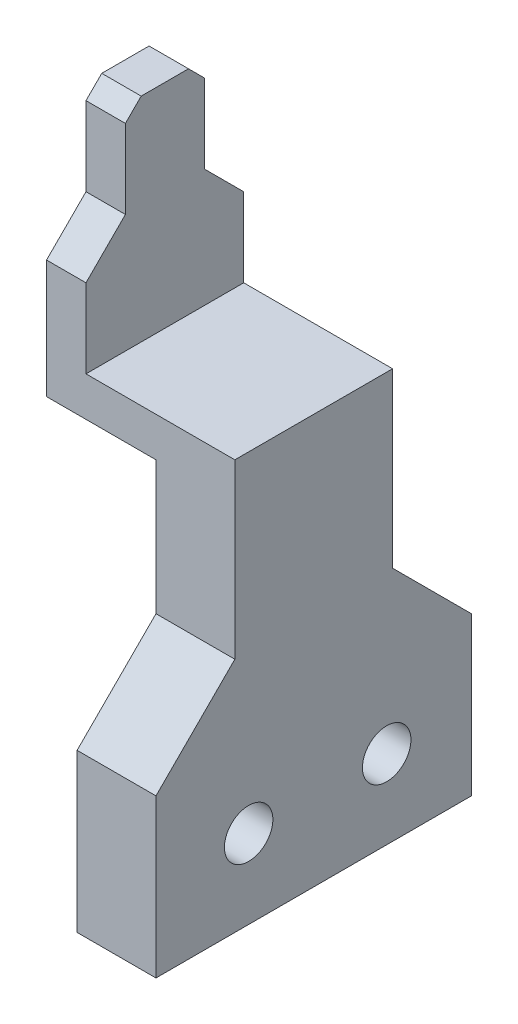
ISO-10303-21;
HEADER;
FILE_DESCRIPTION(('STEP AP214'),'2;1');
FILE_NAME('part.step','',(''),(''),'','','');
FILE_SCHEMA(('AUTOMOTIVE_DESIGN { 1 0 10303 214 1 1 1 1 }'));
ENDSEC;
DATA;
#1=APPLICATION_CONTEXT('core data for automotive mechanical design processes');
#2=APPLICATION_PROTOCOL_DEFINITION('international standard','automotive_design',2000,#1);
#3=PRODUCT_CONTEXT('',#1,'mechanical');
#4=PRODUCT('Part','Part','',(#3));
#5=PRODUCT_RELATED_PRODUCT_CATEGORY('part','',(#4));
#6=PRODUCT_DEFINITION_FORMATION('','',#4);
#7=PRODUCT_DEFINITION_CONTEXT('part definition',#1,'design');
#8=PRODUCT_DEFINITION('design','',#6,#7);
#9=PRODUCT_DEFINITION_SHAPE('','',#8);
#10=(LENGTH_UNIT() NAMED_UNIT(*) SI_UNIT(.MILLI.,.METRE.));
#11=(NAMED_UNIT(*) PLANE_ANGLE_UNIT() SI_UNIT($,.RADIAN.));
#12=(NAMED_UNIT(*) SI_UNIT($,.STERADIAN.) SOLID_ANGLE_UNIT());
#13=UNCERTAINTY_MEASURE_WITH_UNIT(LENGTH_MEASURE(1.E-05),#10,'distance_accuracy_value','');
#14=(GEOMETRIC_REPRESENTATION_CONTEXT(3) GLOBAL_UNCERTAINTY_ASSIGNED_CONTEXT((#13)) GLOBAL_UNIT_ASSIGNED_CONTEXT((#10,
#11,#12)) REPRESENTATION_CONTEXT('',''));
#15=CARTESIAN_POINT('',(0.,0.,0.));
#16=DIRECTION('',(0.,0.,1.));
#17=DIRECTION('',(1.,0.,0.));
#18=AXIS2_PLACEMENT_3D('',#15,#16,#17);
#19=CARTESIAN_POINT('',(10.,0.,0.));
#20=DIRECTION('',(0.,0.,-1.));
#21=DIRECTION('',(-1.,0.,0.));
#22=AXIS2_PLACEMENT_3D('',#19,#20,#21);
#23=PLANE('',#22);
#24=DIRECTION('',(0.,-1.,0.));
#25=VECTOR('',#24,1.);
#26=CARTESIAN_POINT('',(10.,0.,0.));
#27=LINE('',#26,#25);
#28=CARTESIAN_POINT('',(10.,19.9999999999998,0.));
#29=VERTEX_POINT('',#28);
#30=CARTESIAN_POINT('',(10.,0.,0.));
#31=VERTEX_POINT('',#30);
#32=EDGE_CURVE('E267',#29,#31,#27,.T.);
#33=ORIENTED_EDGE('',*,*,#32,.F.);
#34=DIRECTION('',(1.,0.,0.));
#35=VECTOR('',#34,1.);
#36=CARTESIAN_POINT('',(-13.8749999999994,19.9999999999998,0.));
#37=LINE('',#36,#35);
#38=CARTESIAN_POINT('',(0.,19.9999999999998,0.));
#39=VERTEX_POINT('',#38);
#40=EDGE_CURVE('E195',#39,#29,#37,.T.);
#41=ORIENTED_EDGE('',*,*,#40,.F.);
#42=DIRECTION('',(0.,-1.,0.));
#43=VECTOR('',#42,1.);
#44=CARTESIAN_POINT('',(0.,0.,0.));
#45=LINE('',#44,#43);
#46=CARTESIAN_POINT('',(0.,0.,0.));
#47=VERTEX_POINT('',#46);
#48=EDGE_CURVE('E258',#39,#47,#45,.T.);
#49=ORIENTED_EDGE('',*,*,#48,.T.);
#50=DIRECTION('',(-1.,0.,0.));
#51=VECTOR('',#50,1.);
#52=CARTESIAN_POINT('',(10.,0.,0.));
#53=LINE('',#52,#51);
#54=EDGE_CURVE('E283',#31,#47,#53,.T.);
#55=ORIENTED_EDGE('',*,*,#54,.F.);
#56=EDGE_LOOP('',(#33,#41,#49,#55));
#57=FACE_BOUND('',#56,.T.);
#58=ADVANCED_FACE('F41',(#57),#23,.F.);
#59=CARTESIAN_POINT('',(10.,0.,0.));
#60=DIRECTION('',(0.,1.,0.));
#61=DIRECTION('',(0.,0.,1.));
#62=AXIS2_PLACEMENT_3D('',#59,#60,#61);
#63=PLANE('',#62);
#64=DIRECTION('',(0.,0.,-1.));
#65=VECTOR('',#64,1.);
#66=CARTESIAN_POINT('',(0.,0.,0.));
#67=LINE('',#66,#65);
#68=CARTESIAN_POINT('',(0.,0.,-40.));
#69=VERTEX_POINT('',#68);
#70=EDGE_CURVE('E277',#47,#69,#67,.T.);
#71=ORIENTED_EDGE('',*,*,#70,.T.);
#72=DIRECTION('',(-1.,0.,0.));
#73=VECTOR('',#72,1.);
#74=CARTESIAN_POINT('',(10.,0.,-40.));
#75=LINE('',#74,#73);
#76=CARTESIAN_POINT('',(10.,0.,-40.));
#77=VERTEX_POINT('',#76);
#78=EDGE_CURVE('E275',#77,#69,#75,.T.);
#79=ORIENTED_EDGE('',*,*,#78,.F.);
#80=DIRECTION('',(0.,0.,-1.));
#81=VECTOR('',#80,1.);
#82=CARTESIAN_POINT('',(10.,0.,0.));
#83=LINE('',#82,#81);
#84=EDGE_CURVE('E269',#31,#77,#83,.T.);
#85=ORIENTED_EDGE('',*,*,#84,.F.);
#86=ORIENTED_EDGE('',*,*,#54,.T.);
#87=EDGE_LOOP('',(#71,#79,#85,#86));
#88=FACE_BOUND('',#87,.T.);
#89=ADVANCED_FACE('F339',(#88),#63,.F.);
#90=CARTESIAN_POINT('',(10.,0.,-40.));
#91=DIRECTION('',(0.,0.,1.));
#92=DIRECTION('',(1.,0.,0.));
#93=AXIS2_PLACEMENT_3D('',#90,#91,#92);
#94=PLANE('',#93);
#95=DIRECTION('',(0.,1.,0.));
#96=VECTOR('',#95,1.);
#97=CARTESIAN_POINT('',(0.,0.,-40.));
#98=LINE('',#97,#96);
#99=CARTESIAN_POINT('',(0.,20.0000000000004,-40.));
#100=VERTEX_POINT('',#99);
#101=EDGE_CURVE('E270',#69,#100,#98,.T.);
#102=ORIENTED_EDGE('',*,*,#101,.T.);
#103=DIRECTION('',(1.,0.,0.));
#104=VECTOR('',#103,1.);
#105=CARTESIAN_POINT('',(10.,20.0000000000004,-40.));
#106=LINE('',#105,#104);
#107=CARTESIAN_POINT('',(10.,20.0000000000004,-40.));
#108=VERTEX_POINT('',#107);
#109=EDGE_CURVE('E235',#100,#108,#106,.T.);
#110=ORIENTED_EDGE('',*,*,#109,.T.);
#111=DIRECTION('',(0.,1.,0.));
#112=VECTOR('',#111,1.);
#113=CARTESIAN_POINT('',(10.,0.,-40.));
#114=LINE('',#113,#112);
#115=EDGE_CURVE('E272',#77,#108,#114,.T.);
#116=ORIENTED_EDGE('',*,*,#115,.F.);
#117=ORIENTED_EDGE('',*,*,#78,.T.);
#118=EDGE_LOOP('',(#102,#110,#116,#117));
#119=FACE_BOUND('',#118,.T.);
#120=ADVANCED_FACE('F347',(#119),#94,.F.);
#121=CARTESIAN_POINT('',(10.,0.,0.));
#122=DIRECTION('',(-1.,0.,0.));
#123=DIRECTION('',(0.,0.,1.));
#124=AXIS2_PLACEMENT_3D('',#121,#122,#123);
#125=PLANE('',#124);
#126=CARTESIAN_POINT('',(10.,9.99999999999998,-11.75));
#127=DIRECTION('',(1.,0.,0.));
#128=DIRECTION('',(0.,0.,-1.));
#129=AXIS2_PLACEMENT_3D('',#126,#127,#128);
#130=CIRCLE('',#129,3.07375);
#131=CARTESIAN_POINT('',(10.,9.99999999999998,-14.82375));
#132=VERTEX_POINT('',#131);
#133=EDGE_CURVE('E259',#132,#132,#130,.T.);
#134=ORIENTED_EDGE('',*,*,#133,.F.);
#135=EDGE_LOOP('',(#134));
#136=FACE_BOUND('',#135,.T.);
#137=CARTESIAN_POINT('',(10.,9.99999999999997,-29.25));
#138=DIRECTION('',(1.,0.,0.));
#139=DIRECTION('',(0.,0.,-1.));
#140=AXIS2_PLACEMENT_3D('',#137,#138,#139);
#141=CIRCLE('',#140,3.07375000000002);
#142=CARTESIAN_POINT('',(10.,9.99999999999997,-32.32375));
#143=VERTEX_POINT('',#142);
#144=EDGE_CURVE('E262',#143,#143,#141,.T.);
#145=ORIENTED_EDGE('',*,*,#144,.F.);
#146=EDGE_LOOP('',(#145));
#147=FACE_BOUND('',#146,.T.);
#148=ORIENTED_EDGE('',*,*,#115,.T.);
#149=DIRECTION('',(0.,-0.707106781186539,-0.707106781186556));
#150=VECTOR('',#149,1.);
#151=CARTESIAN_POINT('',(10.,30.,-30.0000000000002));
#152=LINE('',#151,#150);
#153=CARTESIAN_POINT('',(10.,30.,-30.0000000000002));
#154=VERTEX_POINT('',#153);
#155=EDGE_CURVE('E214',#154,#108,#152,.T.);
#156=ORIENTED_EDGE('',*,*,#155,.F.);
#157=DIRECTION('',(0.,-1.,0.));
#158=VECTOR('',#157,1.);
#159=CARTESIAN_POINT('',(10.,30.,-30.0000000000002));
#160=LINE('',#159,#158);
#161=CARTESIAN_POINT('',(10.,51.8990199135179,-30.0000000000002));
#162=VERTEX_POINT('',#161);
#163=EDGE_CURVE('E213',#162,#154,#160,.T.);
#164=ORIENTED_EDGE('',*,*,#163,.F.);
#165=DIRECTION('',(0.,0.,-1.));
#166=VECTOR('',#165,1.);
#167=CARTESIAN_POINT('',(10.,51.8990199135179,63.5539941449237));
#168=LINE('',#167,#166);
#169=CARTESIAN_POINT('',(10.,51.8990199135179,-10.0000000000002));
#170=VERTEX_POINT('',#169);
#171=EDGE_CURVE('E239',#170,#162,#168,.T.);
#172=ORIENTED_EDGE('',*,*,#171,.F.);
#173=DIRECTION('',(0.,1.,0.));
#174=VECTOR('',#173,1.);
#175=CARTESIAN_POINT('',(10.,29.9999999999999,-10.0000000000002));
#176=LINE('',#175,#174);
#177=CARTESIAN_POINT('',(10.,29.9999999999999,-10.0000000000002));
#178=VERTEX_POINT('',#177);
#179=EDGE_CURVE('E222',#178,#170,#176,.T.);
#180=ORIENTED_EDGE('',*,*,#179,.F.);
#181=DIRECTION('',(0.,0.707106781186546,-0.707106781186549));
#182=VECTOR('',#181,1.);
#183=CARTESIAN_POINT('',(10.,19.9999999999998,0.));
#184=LINE('',#183,#182);
#185=EDGE_CURVE('E216',#29,#178,#184,.T.);
#186=ORIENTED_EDGE('',*,*,#185,.F.);
#187=ORIENTED_EDGE('',*,*,#32,.T.);
#188=ORIENTED_EDGE('',*,*,#84,.T.);
#189=EDGE_LOOP('',(#148,#156,#164,#172,#180,#186,#187,#188));
#190=FACE_BOUND('',#189,.T.);
#191=ADVANCED_FACE('F402',(#136,#147,#190),#125,.F.);
#192=CARTESIAN_POINT('',(0.,0.,0.));
#193=DIRECTION('',(-1.,0.,0.));
#194=DIRECTION('',(0.,0.,1.));
#195=AXIS2_PLACEMENT_3D('',#192,#193,#194);
#196=PLANE('',#195);
#197=DIRECTION('',(0.,0.707106781186539,0.707106781186556));
#198=VECTOR('',#197,1.);
#199=CARTESIAN_POINT('',(0.,30.0000000000005,-29.9999999999997));
#200=LINE('',#199,#198);
#201=CARTESIAN_POINT('',(0.,30.,-30.0000000000002));
#202=VERTEX_POINT('',#201);
#203=EDGE_CURVE('E293',#100,#202,#200,.T.);
#204=ORIENTED_EDGE('',*,*,#203,.F.);
#205=ORIENTED_EDGE('',*,*,#101,.F.);
#206=ORIENTED_EDGE('',*,*,#70,.F.);
#207=ORIENTED_EDGE('',*,*,#48,.F.);
#208=DIRECTION('',(0.,-0.707106781186546,0.707106781186549));
#209=VECTOR('',#208,1.);
#210=CARTESIAN_POINT('',(0.,9.99999999999994,9.9999999999999));
#211=LINE('',#210,#209);
#212=CARTESIAN_POINT('',(0.,29.9999999999999,-10.0000000000002));
#213=VERTEX_POINT('',#212);
#214=EDGE_CURVE('E291',#213,#39,#211,.T.);
#215=ORIENTED_EDGE('',*,*,#214,.F.);
#216=DIRECTION('',(0.,-1.,0.));
#217=VECTOR('',#216,1.);
#218=CARTESIAN_POINT('',(0.,0.,-10.0000000000002));
#219=LINE('',#218,#217);
#220=CARTESIAN_POINT('',(0.,46.8990199135179,-10.0000000000002));
#221=VERTEX_POINT('',#220);
#222=EDGE_CURVE('E191',#221,#213,#219,.T.);
#223=ORIENTED_EDGE('',*,*,#222,.F.);
#224=DIRECTION('',(0.,0.,-1.));
#225=VECTOR('',#224,1.);
#226=CARTESIAN_POINT('',(0.,46.8990199135179,63.5539941449237));
#227=LINE('',#226,#225);
#228=CARTESIAN_POINT('',(0.,46.8990199135179,-30.0000000000002));
#229=VERTEX_POINT('',#228);
#230=EDGE_CURVE('E238',#221,#229,#227,.T.);
#231=ORIENTED_EDGE('',*,*,#230,.T.);
#232=DIRECTION('',(0.,1.,0.));
#233=VECTOR('',#232,1.);
#234=CARTESIAN_POINT('',(0.,0.,-30.0000000000002));
#235=LINE('',#234,#233);
#236=EDGE_CURVE('E229',#202,#229,#235,.T.);
#237=ORIENTED_EDGE('',*,*,#236,.F.);
#238=EDGE_LOOP('',(#204,#205,#206,#207,#215,#223,#231,#237));
#239=FACE_BOUND('',#238,.T.);
#240=CARTESIAN_POINT('',(0.,9.99999999999998,-11.75));
#241=DIRECTION('',(1.,0.,0.));
#242=DIRECTION('',(0.,0.,-1.));
#243=AXIS2_PLACEMENT_3D('',#240,#241,#242);
#244=CIRCLE('',#243,3.07375);
#245=CARTESIAN_POINT('',(0.,9.99999999999998,-14.82375));
#246=VERTEX_POINT('',#245);
#247=EDGE_CURVE('E255',#246,#246,#244,.T.);
#248=ORIENTED_EDGE('',*,*,#247,.T.);
#249=EDGE_LOOP('',(#248));
#250=FACE_BOUND('',#249,.T.);
#251=CARTESIAN_POINT('',(0.,9.99999999999997,-29.25));
#252=DIRECTION('',(1.,0.,0.));
#253=DIRECTION('',(0.,0.,-1.));
#254=AXIS2_PLACEMENT_3D('',#251,#252,#253);
#255=CIRCLE('',#254,3.07375000000002);
#256=CARTESIAN_POINT('',(0.,9.99999999999997,-32.32375));
#257=VERTEX_POINT('',#256);
#258=EDGE_CURVE('E242',#257,#257,#255,.T.);
#259=ORIENTED_EDGE('',*,*,#258,.T.);
#260=EDGE_LOOP('',(#259));
#261=FACE_BOUND('',#260,.T.);
#262=ADVANCED_FACE('F391',(#239,#250,#261),#196,.T.);
#263=CARTESIAN_POINT('',(0.,9.99999999999997,-29.25));
#264=DIRECTION('',(1.,0.,0.));
#265=DIRECTION('',(0.,0.,-1.));
#266=AXIS2_PLACEMENT_3D('',#263,#264,#265);
#267=CYLINDRICAL_SURFACE('',#266,3.07375000000002);
#268=ORIENTED_EDGE('',*,*,#258,.F.);
#269=EDGE_LOOP('',(#268));
#270=FACE_BOUND('',#269,.T.);
#271=ORIENTED_EDGE('',*,*,#144,.T.);
#272=EDGE_LOOP('',(#271));
#273=FACE_BOUND('',#272,.T.);
#274=ADVANCED_FACE('F424',(#270,#273),#267,.F.);
#275=CARTESIAN_POINT('',(0.,9.99999999999998,-11.75));
#276=DIRECTION('',(1.,0.,0.));
#277=DIRECTION('',(0.,0.,-1.));
#278=AXIS2_PLACEMENT_3D('',#275,#276,#277);
#279=CYLINDRICAL_SURFACE('',#278,3.07375);
#280=ORIENTED_EDGE('',*,*,#247,.F.);
#281=EDGE_LOOP('',(#280));
#282=FACE_BOUND('',#281,.T.);
#283=ORIENTED_EDGE('',*,*,#133,.T.);
#284=EDGE_LOOP('',(#283));
#285=FACE_BOUND('',#284,.T.);
#286=ADVANCED_FACE('F417',(#282,#285),#279,.F.);
#287=CARTESIAN_POINT('',(-8.87499999999941,51.8990199135179,63.5539941449237));
#288=DIRECTION('',(0.,1.,0.));
#289=DIRECTION('',(0.,0.,1.));
#290=AXIS2_PLACEMENT_3D('',#287,#288,#289);
#291=PLANE('',#290);
#292=DIRECTION('',(1.,0.,0.));
#293=VECTOR('',#292,1.);
#294=CARTESIAN_POINT('',(-8.87499999999941,51.8990199135179,-30.0000000000002));
#295=LINE('',#294,#293);
#296=CARTESIAN_POINT('',(-8.87499999999941,51.8990199135179,-30.0000000000002));
#297=VERTEX_POINT('',#296);
#298=EDGE_CURVE('E233',#297,#162,#295,.T.);
#299=ORIENTED_EDGE('',*,*,#298,.F.);
#300=DIRECTION('',(0.,0.,-1.));
#301=VECTOR('',#300,1.);
#302=CARTESIAN_POINT('',(-8.87499999999941,51.8990199135179,63.5539941449237));
#303=LINE('',#302,#301);
#304=CARTESIAN_POINT('',(-8.87499999999941,51.8990199135179,-10.0000000000002));
#305=VERTEX_POINT('',#304);
#306=EDGE_CURVE('E243',#305,#297,#303,.T.);
#307=ORIENTED_EDGE('',*,*,#306,.F.);
#308=DIRECTION('',(-1.,0.,0.));
#309=VECTOR('',#308,1.);
#310=CARTESIAN_POINT('',(-8.87499999999941,51.8990199135179,-10.0000000000002));
#311=LINE('',#310,#309);
#312=EDGE_CURVE('E190',#170,#305,#311,.T.);
#313=ORIENTED_EDGE('',*,*,#312,.F.);
#314=ORIENTED_EDGE('',*,*,#171,.T.);
#315=EDGE_LOOP('',(#299,#307,#313,#314));
#316=FACE_BOUND('',#315,.T.);
#317=ADVANCED_FACE('F415',(#316),#291,.T.);
#318=CARTESIAN_POINT('',(-8.87499999999941,78.8990199135183,63.5539941449237));
#319=DIRECTION('',(1.,0.,0.));
#320=DIRECTION('',(0.,1.,0.));
#321=AXIS2_PLACEMENT_3D('',#318,#319,#320);
#322=PLANE('',#321);
#323=DIRECTION('',(0.,0.,-1.));
#324=VECTOR('',#323,1.);
#325=CARTESIAN_POINT('',(-8.87499999999941,78.8990199135183,63.5539941449237));
#326=LINE('',#325,#324);
#327=CARTESIAN_POINT('',(-8.87499999999941,78.8990199135183,-17.0000000000002));
#328=VERTEX_POINT('',#327);
#329=CARTESIAN_POINT('',(-8.87499999999941,78.8990199135183,-23.0000000000001));
#330=VERTEX_POINT('',#329);
#331=EDGE_CURVE('E245',#328,#330,#326,.T.);
#332=ORIENTED_EDGE('',*,*,#331,.F.);
#333=DIRECTION('',(0.,-0.707106781186549,0.707106781186546));
#334=VECTOR('',#333,1.);
#335=CARTESIAN_POINT('',(-8.87499999999942,38.6220228410564,23.2769970724616));
#336=LINE('',#335,#334);
#337=CARTESIAN_POINT('',(-8.87499999999941,76.8990199135183,-15.0000000000002));
#338=VERTEX_POINT('',#337);
#339=EDGE_CURVE('E312',#328,#338,#336,.T.);
#340=ORIENTED_EDGE('',*,*,#339,.T.);
#341=DIRECTION('',(0.,1.,0.));
#342=VECTOR('',#341,1.);
#343=CARTESIAN_POINT('',(-8.87499999999941,61.8990199135187,-15.0000000000002));
#344=LINE('',#343,#342);
#345=CARTESIAN_POINT('',(-8.87499999999941,66.8990199135188,-15.0000000000002));
#346=VERTEX_POINT('',#345);
#347=EDGE_CURVE('E177',#346,#338,#344,.T.);
#348=ORIENTED_EDGE('',*,*,#347,.F.);
#349=DIRECTION('',(0.,0.707106781186552,-0.707106781186543));
#350=VECTOR('',#349,1.);
#351=CARTESIAN_POINT('',(-8.87499999999941,66.8990199135188,-15.0000000000002));
#352=LINE('',#351,#350);
#353=CARTESIAN_POINT('',(-8.87499999999941,61.8990199135187,-10.0000000000001));
#354=VERTEX_POINT('',#353);
#355=EDGE_CURVE('E170',#346,#354,#352,.F.);
#356=ORIENTED_EDGE('',*,*,#355,.T.);
#357=DIRECTION('',(0.,1.,0.));
#358=VECTOR('',#357,1.);
#359=CARTESIAN_POINT('',(-8.87499999999941,78.8990199135183,-10.0000000000002));
#360=LINE('',#359,#358);
#361=EDGE_CURVE('E175',#305,#354,#360,.T.);
#362=ORIENTED_EDGE('',*,*,#361,.F.);
#363=ORIENTED_EDGE('',*,*,#306,.T.);
#364=DIRECTION('',(0.,-1.,0.));
#365=VECTOR('',#364,1.);
#366=CARTESIAN_POINT('',(-8.87499999999941,78.8990199135183,-30.0000000000002));
#367=LINE('',#366,#365);
#368=CARTESIAN_POINT('',(-8.87499999999941,61.8990199135187,-30.0000000000002));
#369=VERTEX_POINT('',#368);
#370=EDGE_CURVE('E231',#369,#297,#367,.T.);
#371=ORIENTED_EDGE('',*,*,#370,.F.);
#372=DIRECTION('',(0.,-0.707106781186544,-0.707106781186551));
#373=VECTOR('',#372,1.);
#374=CARTESIAN_POINT('',(-8.87499999999941,61.8990199135187,-30.0000000000002));
#375=LINE('',#374,#373);
#376=CARTESIAN_POINT('',(-8.87499999999941,66.8990199135187,-25.0000000000001));
#377=VERTEX_POINT('',#376);
#378=EDGE_CURVE('E300',#369,#377,#375,.F.);
#379=ORIENTED_EDGE('',*,*,#378,.T.);
#380=DIRECTION('',(0.,-1.,0.));
#381=VECTOR('',#380,1.);
#382=CARTESIAN_POINT('',(-8.87499999999941,78.8990199135183,-25.0000000000002));
#383=LINE('',#382,#381);
#384=CARTESIAN_POINT('',(-8.87499999999941,76.8990199135183,-25.0000000000002));
#385=VERTEX_POINT('',#384);
#386=EDGE_CURVE('E207',#385,#377,#383,.T.);
#387=ORIENTED_EDGE('',*,*,#386,.F.);
#388=DIRECTION('',(0.,0.707106781186543,0.707106781186552));
#389=VECTOR('',#388,1.);
#390=CARTESIAN_POINT('',(-8.87499999999941,122.17601698598,20.2769970724624));
#391=LINE('',#390,#389);
#392=EDGE_CURVE('E310',#385,#330,#391,.T.);
#393=ORIENTED_EDGE('',*,*,#392,.T.);
#394=EDGE_LOOP('',(#332,#340,#348,#356,#362,#363,#371,#379,#387,#393));
#395=FACE_BOUND('',#394,.T.);
#396=ADVANCED_FACE('F173',(#395),#322,.T.);
#397=CARTESIAN_POINT('',(-13.8749999999994,78.8990199135183,63.5539941449237));
#398=DIRECTION('',(0.,1.,0.));
#399=DIRECTION('',(0.,0.,1.));
#400=AXIS2_PLACEMENT_3D('',#397,#398,#399);
#401=PLANE('',#400);
#402=DIRECTION('',(0.,0.,-1.));
#403=VECTOR('',#402,1.);
#404=CARTESIAN_POINT('',(-13.8749999999994,78.8990199135183,63.5539941449237));
#405=LINE('',#404,#403);
#406=CARTESIAN_POINT('',(-13.8749999999994,78.8990199135183,-17.0000000000002));
#407=VERTEX_POINT('',#406);
#408=CARTESIAN_POINT('',(-13.8749999999994,78.8990199135183,-23.0000000000001));
#409=VERTEX_POINT('',#408);
#410=EDGE_CURVE('E248',#407,#409,#405,.T.);
#411=ORIENTED_EDGE('',*,*,#410,.F.);
#412=DIRECTION('',(1.,0.,0.));
#413=VECTOR('',#412,1.);
#414=CARTESIAN_POINT('',(-8.87499999999941,78.8990199135183,-17.0000000000002));
#415=LINE('',#414,#413);
#416=EDGE_CURVE('E307',#407,#328,#415,.T.);
#417=ORIENTED_EDGE('',*,*,#416,.T.);
#418=ORIENTED_EDGE('',*,*,#331,.T.);
#419=DIRECTION('',(-1.,0.,0.));
#420=VECTOR('',#419,1.);
#421=CARTESIAN_POINT('',(-13.8749999999994,78.8990199135183,-23.0000000000001));
#422=LINE('',#421,#420);
#423=EDGE_CURVE('E305',#330,#409,#422,.T.);
#424=ORIENTED_EDGE('',*,*,#423,.T.);
#425=EDGE_LOOP('',(#411,#417,#418,#424));
#426=FACE_BOUND('',#425,.T.);
#427=ADVANCED_FACE('F321',(#426),#401,.T.);
#428=CARTESIAN_POINT('',(-13.8749999999994,46.8990199135179,63.5539941449237));
#429=DIRECTION('',(-1.,0.,0.));
#430=DIRECTION('',(0.,0.,1.));
#431=AXIS2_PLACEMENT_3D('',#428,#429,#430);
#432=PLANE('',#431);
#433=DIRECTION('',(0.,1.,0.));
#434=VECTOR('',#433,1.);
#435=CARTESIAN_POINT('',(-13.8749999999994,61.8990199135187,-15.0000000000002));
#436=LINE('',#435,#434);
#437=CARTESIAN_POINT('',(-13.8749999999994,66.8990199135188,-15.0000000000002));
#438=VERTEX_POINT('',#437);
#439=CARTESIAN_POINT('',(-13.8749999999994,76.8990199135183,-15.0000000000002));
#440=VERTEX_POINT('',#439);
#441=EDGE_CURVE('E196',#438,#440,#436,.T.);
#442=ORIENTED_EDGE('',*,*,#441,.T.);
#443=DIRECTION('',(0.,0.707106781186549,-0.707106781186546));
#444=VECTOR('',#443,1.);
#445=CARTESIAN_POINT('',(-13.8749999999994,22.6220228410561,39.2769970724618));
#446=LINE('',#445,#444);
#447=EDGE_CURVE('E50',#440,#407,#446,.T.);
#448=ORIENTED_EDGE('',*,*,#447,.T.);
#449=ORIENTED_EDGE('',*,*,#410,.T.);
#450=DIRECTION('',(0.,-0.707106781186543,-0.707106781186552));
#451=VECTOR('',#450,1.);
#452=CARTESIAN_POINT('',(-13.8749999999994,106.17601698598,4.27699707246221));
#453=LINE('',#452,#451);
#454=CARTESIAN_POINT('',(-13.8749999999994,76.8990199135183,-25.0000000000002));
#455=VERTEX_POINT('',#454);
#456=EDGE_CURVE('E57',#409,#455,#453,.T.);
#457=ORIENTED_EDGE('',*,*,#456,.T.);
#458=DIRECTION('',(0.,-1.,0.));
#459=VECTOR('',#458,1.);
#460=CARTESIAN_POINT('',(-13.8749999999994,78.8990199135183,-25.0000000000002));
#461=LINE('',#460,#459);
#462=CARTESIAN_POINT('',(-13.8749999999994,66.8990199135187,-25.0000000000001));
#463=VERTEX_POINT('',#462);
#464=EDGE_CURVE('E206',#455,#463,#461,.T.);
#465=ORIENTED_EDGE('',*,*,#464,.T.);
#466=DIRECTION('',(0.,0.707106781186544,0.707106781186551));
#467=VECTOR('',#466,1.);
#468=CARTESIAN_POINT('',(-13.8749999999994,61.8990199135187,-30.0000000000002));
#469=LINE('',#468,#467);
#470=CARTESIAN_POINT('',(-13.8749999999994,61.8990199135187,-30.0000000000002));
#471=VERTEX_POINT('',#470);
#472=EDGE_CURVE('E183',#463,#471,#469,.F.);
#473=ORIENTED_EDGE('',*,*,#472,.T.);
#474=DIRECTION('',(0.,-1.,0.));
#475=VECTOR('',#474,1.);
#476=CARTESIAN_POINT('',(-13.8749999999994,30.,-30.0000000000002));
#477=LINE('',#476,#475);
#478=CARTESIAN_POINT('',(-13.8749999999994,46.8990199135179,-30.0000000000002));
#479=VERTEX_POINT('',#478);
#480=EDGE_CURVE('E210',#471,#479,#477,.T.);
#481=ORIENTED_EDGE('',*,*,#480,.T.);
#482=DIRECTION('',(0.,0.,-1.));
#483=VECTOR('',#482,1.);
#484=CARTESIAN_POINT('',(-13.8749999999994,46.8990199135179,63.5539941449237));
#485=LINE('',#484,#483);
#486=CARTESIAN_POINT('',(-13.8749999999994,46.8990199135179,-10.0000000000002));
#487=VERTEX_POINT('',#486);
#488=EDGE_CURVE('E250',#487,#479,#485,.T.);
#489=ORIENTED_EDGE('',*,*,#488,.F.);
#490=DIRECTION('',(0.,1.,0.));
#491=VECTOR('',#490,1.);
#492=CARTESIAN_POINT('',(-13.8749999999994,29.9999999999999,-10.0000000000002));
#493=LINE('',#492,#491);
#494=CARTESIAN_POINT('',(-13.8749999999994,61.8990199135187,-10.0000000000002));
#495=VERTEX_POINT('',#494);
#496=EDGE_CURVE('E220',#487,#495,#493,.T.);
#497=ORIENTED_EDGE('',*,*,#496,.T.);
#498=DIRECTION('',(0.,-0.707106781186552,0.707106781186543));
#499=VECTOR('',#498,1.);
#500=CARTESIAN_POINT('',(-13.8749999999994,66.8990199135188,-15.0000000000002));
#501=LINE('',#500,#499);
#502=EDGE_CURVE('E182',#495,#438,#501,.F.);
#503=ORIENTED_EDGE('',*,*,#502,.T.);
#504=EDGE_LOOP('',(#442,#448,#449,#457,#465,#473,#481,#489,#497,#503));
#505=FACE_BOUND('',#504,.T.);
#506=ADVANCED_FACE('F317',(#505),#432,.T.);
#507=CARTESIAN_POINT('',(0.,46.8990199135179,63.5539941449237));
#508=DIRECTION('',(0.,-1.,0.));
#509=DIRECTION('',(0.,0.,-1.));
#510=AXIS2_PLACEMENT_3D('',#507,#508,#509);
#511=PLANE('',#510);
#512=DIRECTION('',(-1.,0.,0.));
#513=VECTOR('',#512,1.);
#514=CARTESIAN_POINT('',(0.,46.8990199135179,-30.0000000000002));
#515=LINE('',#514,#513);
#516=EDGE_CURVE('E288',#229,#479,#515,.T.);
#517=ORIENTED_EDGE('',*,*,#516,.F.);
#518=ORIENTED_EDGE('',*,*,#230,.F.);
#519=DIRECTION('',(1.,0.,0.));
#520=VECTOR('',#519,1.);
#521=CARTESIAN_POINT('',(0.,46.8990199135179,-10.0000000000002));
#522=LINE('',#521,#520);
#523=EDGE_CURVE('E286',#487,#221,#522,.T.);
#524=ORIENTED_EDGE('',*,*,#523,.F.);
#525=ORIENTED_EDGE('',*,*,#488,.T.);
#526=EDGE_LOOP('',(#517,#518,#524,#525));
#527=FACE_BOUND('',#526,.T.);
#528=ADVANCED_FACE('F385',(#527),#511,.T.);
#529=CARTESIAN_POINT('',(-13.8749999999994,19.9999999999998,0.));
#530=DIRECTION('',(0.,-0.707106781186549,-0.707106781186546));
#531=DIRECTION('',(0.,0.707106781186546,-0.707106781186549));
#532=AXIS2_PLACEMENT_3D('',#529,#530,#531);
#533=PLANE('',#532);
#534=ORIENTED_EDGE('',*,*,#214,.T.);
#535=ORIENTED_EDGE('',*,*,#40,.T.);
#536=ORIENTED_EDGE('',*,*,#185,.T.);
#537=DIRECTION('',(1.,0.,0.));
#538=VECTOR('',#537,1.);
#539=CARTESIAN_POINT('',(-13.8749999999994,29.9999999999999,-10.0000000000002));
#540=LINE('',#539,#538);
#541=EDGE_CURVE('E198',#213,#178,#540,.T.);
#542=ORIENTED_EDGE('',*,*,#541,.F.);
#543=EDGE_LOOP('',(#534,#535,#536,#542));
#544=FACE_BOUND('',#543,.T.);
#545=ADVANCED_FACE('F397',(#544),#533,.F.);
#546=CARTESIAN_POINT('',(-13.8749999999994,29.9999999999999,-10.0000000000002));
#547=DIRECTION('',(0.,0.,-1.));
#548=DIRECTION('',(-1.,0.,0.));
#549=AXIS2_PLACEMENT_3D('',#546,#547,#548);
#550=PLANE('',#549);
#551=ORIENTED_EDGE('',*,*,#361,.T.);
#552=DIRECTION('',(1.,0.,0.));
#553=VECTOR('',#552,1.);
#554=CARTESIAN_POINT('',(-13.8749999999994,61.8990199135187,-10.0000000000001));
#555=LINE('',#554,#553);
#556=EDGE_CURVE('E187',#495,#354,#555,.T.);
#557=ORIENTED_EDGE('',*,*,#556,.F.);
#558=ORIENTED_EDGE('',*,*,#496,.F.);
#559=ORIENTED_EDGE('',*,*,#523,.T.);
#560=ORIENTED_EDGE('',*,*,#222,.T.);
#561=ORIENTED_EDGE('',*,*,#541,.T.);
#562=ORIENTED_EDGE('',*,*,#179,.T.);
#563=ORIENTED_EDGE('',*,*,#312,.T.);
#564=EDGE_LOOP('',(#551,#557,#558,#559,#560,#561,#562,#563));
#565=FACE_BOUND('',#564,.T.);
#566=ADVANCED_FACE('F186',(#565),#550,.F.);
#567=CARTESIAN_POINT('',(-13.8749999999994,30.,-30.0000000000002));
#568=DIRECTION('',(0.,-0.707106781186556,0.707106781186539));
#569=DIRECTION('',(0.,-0.707106781186539,-0.707106781186556));
#570=AXIS2_PLACEMENT_3D('',#567,#568,#569);
#571=PLANE('',#570);
#572=ORIENTED_EDGE('',*,*,#203,.T.);
#573=DIRECTION('',(1.,0.,0.));
#574=VECTOR('',#573,1.);
#575=CARTESIAN_POINT('',(-13.8749999999994,30.,-30.0000000000002));
#576=LINE('',#575,#574);
#577=EDGE_CURVE('E212',#202,#154,#576,.T.);
#578=ORIENTED_EDGE('',*,*,#577,.T.);
#579=ORIENTED_EDGE('',*,*,#155,.T.);
#580=ORIENTED_EDGE('',*,*,#109,.F.);
#581=EDGE_LOOP('',(#572,#578,#579,#580));
#582=FACE_BOUND('',#581,.T.);
#583=ADVANCED_FACE('F412',(#582),#571,.F.);
#584=CARTESIAN_POINT('',(-13.8749999999994,30.,-30.0000000000002));
#585=DIRECTION('',(0.,0.,1.));
#586=DIRECTION('',(1.,0.,0.));
#587=AXIS2_PLACEMENT_3D('',#584,#585,#586);
#588=PLANE('',#587);
#589=ORIENTED_EDGE('',*,*,#480,.F.);
#590=DIRECTION('',(1.,0.,0.));
#591=VECTOR('',#590,1.);
#592=CARTESIAN_POINT('',(-13.8749999999994,61.8990199135187,-30.0000000000002));
#593=LINE('',#592,#591);
#594=EDGE_CURVE('E203',#471,#369,#593,.T.);
#595=ORIENTED_EDGE('',*,*,#594,.T.);
#596=ORIENTED_EDGE('',*,*,#370,.T.);
#597=ORIENTED_EDGE('',*,*,#298,.T.);
#598=ORIENTED_EDGE('',*,*,#163,.T.);
#599=ORIENTED_EDGE('',*,*,#577,.F.);
#600=ORIENTED_EDGE('',*,*,#236,.T.);
#601=ORIENTED_EDGE('',*,*,#516,.T.);
#602=EDGE_LOOP('',(#589,#595,#596,#597,#598,#599,#600,#601));
#603=FACE_BOUND('',#602,.T.);
#604=ADVANCED_FACE('F335',(#603),#588,.F.);
#605=CARTESIAN_POINT('',(-13.8749999999994,78.8990199135183,-25.0000000000002));
#606=DIRECTION('',(0.,0.,1.));
#607=DIRECTION('',(0.,-1.,0.));
#608=AXIS2_PLACEMENT_3D('',#605,#606,#607);
#609=PLANE('',#608);
#610=ORIENTED_EDGE('',*,*,#464,.F.);
#611=DIRECTION('',(1.,0.,0.));
#612=VECTOR('',#611,1.);
#613=CARTESIAN_POINT('',(-8.87499999999941,76.8990199135183,-25.0000000000002));
#614=LINE('',#613,#612);
#615=EDGE_CURVE('E11',#455,#385,#614,.T.);
#616=ORIENTED_EDGE('',*,*,#615,.T.);
#617=ORIENTED_EDGE('',*,*,#386,.T.);
#618=DIRECTION('',(-1.,0.,0.));
#619=VECTOR('',#618,1.);
#620=CARTESIAN_POINT('',(-13.8749999999994,66.8990199135187,-25.0000000000001));
#621=LINE('',#620,#619);
#622=EDGE_CURVE('E295',#377,#463,#621,.T.);
#623=ORIENTED_EDGE('',*,*,#622,.T.);
#624=EDGE_LOOP('',(#610,#616,#617,#623));
#625=FACE_BOUND('',#624,.T.);
#626=ADVANCED_FACE('F327',(#625),#609,.F.);
#627=CARTESIAN_POINT('',(-13.8749999999994,61.8990199135187,-15.0000000000002));
#628=DIRECTION('',(0.,0.,-1.));
#629=DIRECTION('',(-1.,0.,0.));
#630=AXIS2_PLACEMENT_3D('',#627,#628,#629);
#631=PLANE('',#630);
#632=ORIENTED_EDGE('',*,*,#347,.T.);
#633=DIRECTION('',(-1.,0.,0.));
#634=VECTOR('',#633,1.);
#635=CARTESIAN_POINT('',(-13.8749999999994,76.8990199135183,-15.0000000000002));
#636=LINE('',#635,#634);
#637=EDGE_CURVE('E65',#338,#440,#636,.T.);
#638=ORIENTED_EDGE('',*,*,#637,.T.);
#639=ORIENTED_EDGE('',*,*,#441,.F.);
#640=DIRECTION('',(1.,0.,0.));
#641=VECTOR('',#640,1.);
#642=CARTESIAN_POINT('',(-8.87499999999941,66.8990199135188,-15.0000000000002));
#643=LINE('',#642,#641);
#644=EDGE_CURVE('E298',#438,#346,#643,.T.);
#645=ORIENTED_EDGE('',*,*,#644,.T.);
#646=EDGE_LOOP('',(#632,#638,#639,#645));
#647=FACE_BOUND('',#646,.T.);
#648=ADVANCED_FACE('F324',(#647),#631,.F.);
#649=CARTESIAN_POINT('',(-13.8749999999994,61.8990199135187,-30.0000000000002));
#650=DIRECTION('',(0.,0.707106781186551,-0.707106781186544));
#651=DIRECTION('',(-1.,0.,0.));
#652=AXIS2_PLACEMENT_3D('',#649,#650,#651);
#653=PLANE('',#652);
#654=ORIENTED_EDGE('',*,*,#472,.F.);
#655=ORIENTED_EDGE('',*,*,#622,.F.);
#656=ORIENTED_EDGE('',*,*,#378,.F.);
#657=ORIENTED_EDGE('',*,*,#594,.F.);
#658=EDGE_LOOP('',(#654,#655,#656,#657));
#659=FACE_BOUND('',#658,.T.);
#660=ADVANCED_FACE('F326',(#659),#653,.T.);
#661=CARTESIAN_POINT('',(-13.8749999999994,66.8990199135188,-15.0000000000002));
#662=DIRECTION('',(0.,0.707106781186543,0.707106781186552));
#663=DIRECTION('',(-1.,0.,0.));
#664=AXIS2_PLACEMENT_3D('',#661,#662,#663);
#665=PLANE('',#664);
#666=ORIENTED_EDGE('',*,*,#502,.F.);
#667=ORIENTED_EDGE('',*,*,#556,.T.);
#668=ORIENTED_EDGE('',*,*,#355,.F.);
#669=ORIENTED_EDGE('',*,*,#644,.F.);
#670=EDGE_LOOP('',(#666,#667,#668,#669));
#671=FACE_BOUND('',#670,.T.);
#672=ADVANCED_FACE('F194',(#671),#665,.T.);
#673=CARTESIAN_POINT('',(-13.8749999999994,78.8990199135183,-17.0000000000002));
#674=DIRECTION('',(0.,0.707106781186546,0.707106781186549));
#675=DIRECTION('',(-1.,0.,0.));
#676=AXIS2_PLACEMENT_3D('',#673,#674,#675);
#677=PLANE('',#676);
#678=ORIENTED_EDGE('',*,*,#447,.F.);
#679=ORIENTED_EDGE('',*,*,#637,.F.);
#680=ORIENTED_EDGE('',*,*,#339,.F.);
#681=ORIENTED_EDGE('',*,*,#416,.F.);
#682=EDGE_LOOP('',(#678,#679,#680,#681));
#683=FACE_BOUND('',#682,.T.);
#684=ADVANCED_FACE('F323',(#683),#677,.T.);
#685=CARTESIAN_POINT('',(-13.8749999999994,76.8990199135183,-25.0000000000002));
#686=DIRECTION('',(0.,0.707106781186552,-0.707106781186542));
#687=DIRECTION('',(-1.,0.,0.));
#688=AXIS2_PLACEMENT_3D('',#685,#686,#687);
#689=PLANE('',#688);
#690=ORIENTED_EDGE('',*,*,#456,.F.);
#691=ORIENTED_EDGE('',*,*,#423,.F.);
#692=ORIENTED_EDGE('',*,*,#392,.F.);
#693=ORIENTED_EDGE('',*,*,#615,.F.);
#694=EDGE_LOOP('',(#690,#691,#692,#693));
#695=FACE_BOUND('',#694,.T.);
#696=ADVANCED_FACE('F44',(#695),#689,.T.);
#697=CLOSED_SHELL('',(#58,#89,#120,#191,#262,#274,#286,#317,#396,#427,#506,#528,#545,#566,#583,
#604,#626,#648,#660,#672,#684,#696));
#698=MANIFOLD_SOLID_BREP('B2',#697);
#699=ADVANCED_BREP_SHAPE_REPRESENTATION('',(#18,#698),#14);
#700=SHAPE_DEFINITION_REPRESENTATION(#9,#699);
ENDSEC;
END-ISO-10303-21;
